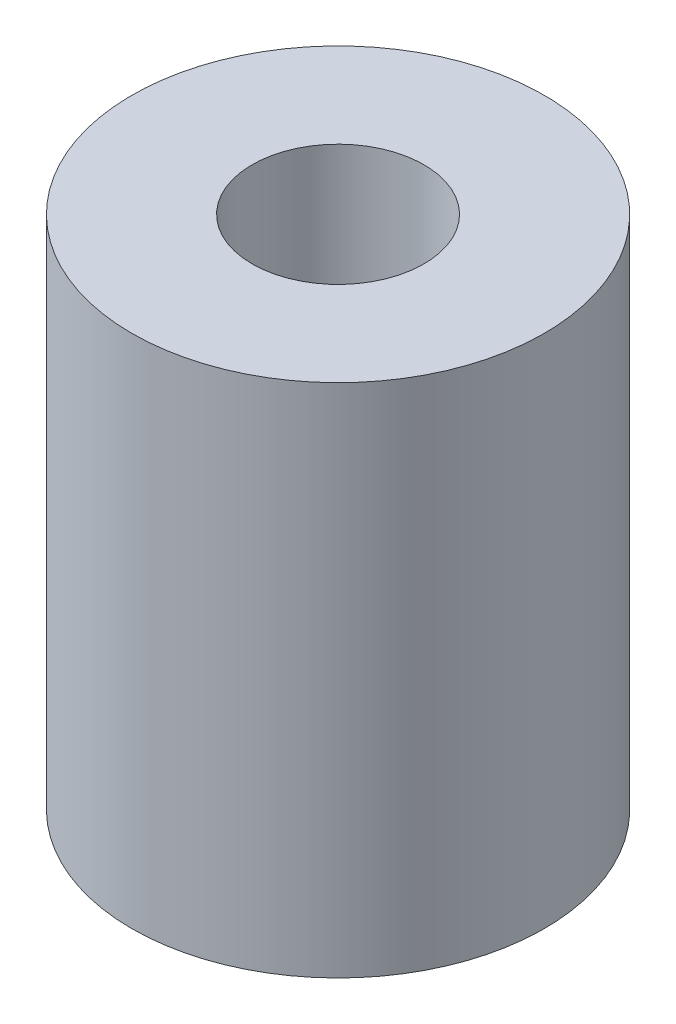
ISO-10303-21;
HEADER;
FILE_DESCRIPTION(('STEP AP214'),'2;1');
FILE_NAME('part.step','',(''),(''),'','','');
FILE_SCHEMA(('AUTOMOTIVE_DESIGN { 1 0 10303 214 1 1 1 1 }'));
ENDSEC;
DATA;
#1=APPLICATION_CONTEXT('core data for automotive mechanical design processes');
#2=APPLICATION_PROTOCOL_DEFINITION('international standard','automotive_design',2000,#1);
#3=PRODUCT_CONTEXT('',#1,'mechanical');
#4=PRODUCT('Part','Part','',(#3));
#5=PRODUCT_RELATED_PRODUCT_CATEGORY('part','',(#4));
#6=PRODUCT_DEFINITION_FORMATION('','',#4);
#7=PRODUCT_DEFINITION_CONTEXT('part definition',#1,'design');
#8=PRODUCT_DEFINITION('design','',#6,#7);
#9=PRODUCT_DEFINITION_SHAPE('','',#8);
#10=(LENGTH_UNIT() NAMED_UNIT(*) SI_UNIT(.MILLI.,.METRE.));
#11=(NAMED_UNIT(*) PLANE_ANGLE_UNIT() SI_UNIT($,.RADIAN.));
#12=(NAMED_UNIT(*) SI_UNIT($,.STERADIAN.) SOLID_ANGLE_UNIT());
#13=UNCERTAINTY_MEASURE_WITH_UNIT(LENGTH_MEASURE(1.E-05),#10,'distance_accuracy_value','');
#14=(GEOMETRIC_REPRESENTATION_CONTEXT(3) GLOBAL_UNCERTAINTY_ASSIGNED_CONTEXT((#13)) GLOBAL_UNIT_ASSIGNED_CONTEXT((#10,
#11,#12)) REPRESENTATION_CONTEXT('',''));
#15=CARTESIAN_POINT('',(0.,0.,0.));
#16=DIRECTION('',(0.,0.,1.));
#17=DIRECTION('',(1.,0.,0.));
#18=AXIS2_PLACEMENT_3D('',#15,#16,#17);
#19=CARTESIAN_POINT('',(0.,15.,0.));
#20=DIRECTION('',(0.,-1.,0.));
#21=DIRECTION('',(0.,0.,-1.));
#22=AXIS2_PLACEMENT_3D('',#19,#20,#21);
#23=CYLINDRICAL_SURFACE('',#22,6.);
#24=CARTESIAN_POINT('',(0.,15.,0.));
#25=DIRECTION('',(0.,1.,0.));
#26=DIRECTION('',(0.,0.,1.));
#27=AXIS2_PLACEMENT_3D('',#24,#25,#26);
#28=CIRCLE('',#27,6.);
#29=CARTESIAN_POINT('',(0.,15.,6.));
#30=VERTEX_POINT('',#29);
#31=EDGE_CURVE('E10',#30,#30,#28,.T.);
#32=ORIENTED_EDGE('',*,*,#31,.F.);
#33=EDGE_LOOP('',(#32));
#34=FACE_BOUND('',#33,.T.);
#35=CARTESIAN_POINT('',(0.,0.,0.));
#36=DIRECTION('',(0.,1.,0.));
#37=DIRECTION('',(0.,0.,1.));
#38=AXIS2_PLACEMENT_3D('',#35,#36,#37);
#39=CIRCLE('',#38,6.);
#40=CARTESIAN_POINT('',(0.,0.,6.));
#41=VERTEX_POINT('',#40);
#42=EDGE_CURVE('E34',#41,#41,#39,.T.);
#43=ORIENTED_EDGE('',*,*,#42,.T.);
#44=EDGE_LOOP('',(#43));
#45=FACE_BOUND('',#44,.T.);
#46=ADVANCED_FACE('F31',(#34,#45),#23,.T.);
#47=CARTESIAN_POINT('',(0.,15.,0.));
#48=DIRECTION('',(0.,1.,0.));
#49=DIRECTION('',(0.,0.,1.));
#50=AXIS2_PLACEMENT_3D('',#47,#48,#49);
#51=PLANE('',#50);
#52=CARTESIAN_POINT('',(0.,15.,0.));
#53=DIRECTION('',(0.,1.,0.));
#54=DIRECTION('',(0.,0.,1.));
#55=AXIS2_PLACEMENT_3D('',#52,#53,#54);
#56=CIRCLE('',#55,2.5);
#57=CARTESIAN_POINT('',(0.,15.,2.5));
#58=VERTEX_POINT('',#57);
#59=EDGE_CURVE('E43',#58,#58,#56,.T.);
#60=ORIENTED_EDGE('',*,*,#59,.F.);
#61=EDGE_LOOP('',(#60));
#62=FACE_BOUND('',#61,.T.);
#63=ORIENTED_EDGE('',*,*,#31,.T.);
#64=EDGE_LOOP('',(#63));
#65=FACE_BOUND('',#64,.T.);
#66=ADVANCED_FACE('F58',(#62,#65),#51,.T.);
#67=CARTESIAN_POINT('',(0.,0.,0.));
#68=DIRECTION('',(0.,1.,0.));
#69=DIRECTION('',(0.,0.,1.));
#70=AXIS2_PLACEMENT_3D('',#67,#68,#69);
#71=PLANE('',#70);
#72=CARTESIAN_POINT('',(0.,0.,0.));
#73=DIRECTION('',(0.,1.,0.));
#74=DIRECTION('',(0.,0.,1.));
#75=AXIS2_PLACEMENT_3D('',#72,#73,#74);
#76=CIRCLE('',#75,2.5);
#77=CARTESIAN_POINT('',(0.,0.,2.5));
#78=VERTEX_POINT('',#77);
#79=EDGE_CURVE('E41',#78,#78,#76,.T.);
#80=ORIENTED_EDGE('',*,*,#79,.T.);
#81=EDGE_LOOP('',(#80));
#82=FACE_BOUND('',#81,.T.);
#83=ORIENTED_EDGE('',*,*,#42,.F.);
#84=EDGE_LOOP('',(#83));
#85=FACE_BOUND('',#84,.T.);
#86=ADVANCED_FACE('F49',(#82,#85),#71,.F.);
#87=CARTESIAN_POINT('',(0.,0.,0.));
#88=DIRECTION('',(0.,1.,0.));
#89=DIRECTION('',(0.,0.,1.));
#90=AXIS2_PLACEMENT_3D('',#87,#88,#89);
#91=CYLINDRICAL_SURFACE('',#90,2.5);
#92=ORIENTED_EDGE('',*,*,#79,.F.);
#93=EDGE_LOOP('',(#92));
#94=FACE_BOUND('',#93,.T.);
#95=ORIENTED_EDGE('',*,*,#59,.T.);
#96=EDGE_LOOP('',(#95));
#97=FACE_BOUND('',#96,.T.);
#98=ADVANCED_FACE('F52',(#94,#97),#91,.F.);
#99=CLOSED_SHELL('',(#46,#66,#86,#98));
#100=MANIFOLD_SOLID_BREP('B2',#99);
#101=ADVANCED_BREP_SHAPE_REPRESENTATION('',(#18,#100),#14);
#102=SHAPE_DEFINITION_REPRESENTATION(#9,#101);
ENDSEC;
END-ISO-10303-21;
